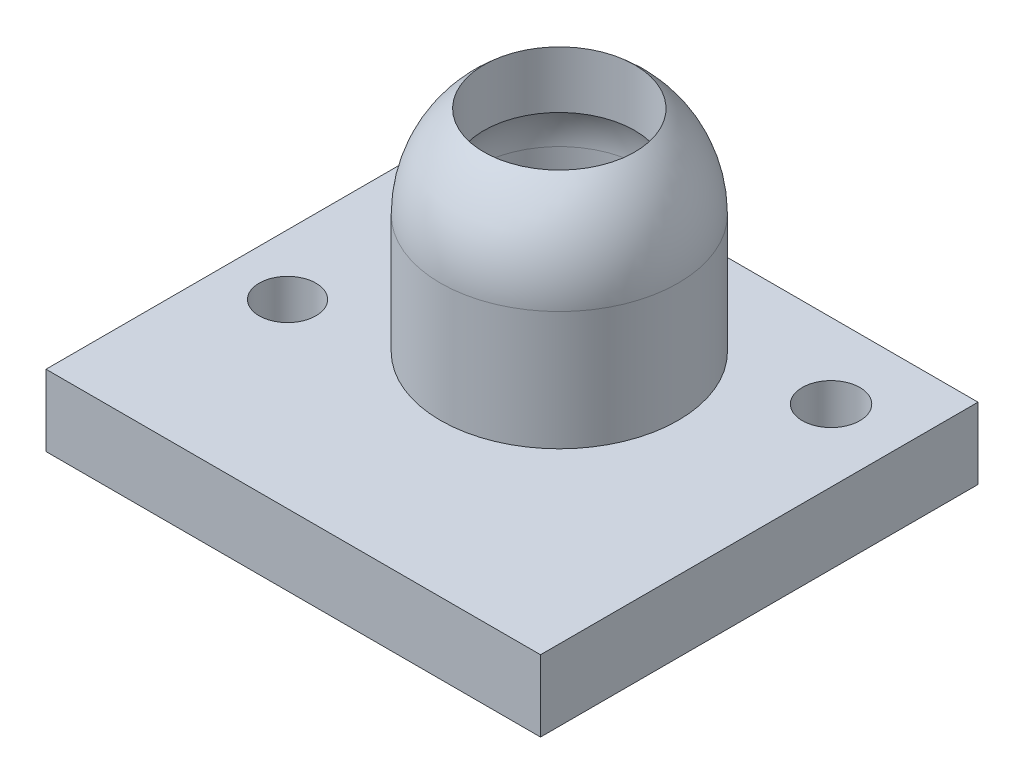
ISO-10303-21;
HEADER;
FILE_DESCRIPTION(('STEP AP214'),'2;1');
FILE_NAME('part.step','',(''),(''),'','','');
FILE_SCHEMA(('AUTOMOTIVE_DESIGN { 1 0 10303 214 1 1 1 1 }'));
ENDSEC;
DATA;
#1=APPLICATION_CONTEXT('core data for automotive mechanical design processes');
#2=APPLICATION_PROTOCOL_DEFINITION('international standard','automotive_design',2000,#1);
#3=PRODUCT_CONTEXT('',#1,'mechanical');
#4=PRODUCT('Part','Part','',(#3));
#5=PRODUCT_RELATED_PRODUCT_CATEGORY('part','',(#4));
#6=PRODUCT_DEFINITION_FORMATION('','',#4);
#7=PRODUCT_DEFINITION_CONTEXT('part definition',#1,'design');
#8=PRODUCT_DEFINITION('design','',#6,#7);
#9=PRODUCT_DEFINITION_SHAPE('','',#8);
#10=(LENGTH_UNIT() NAMED_UNIT(*) SI_UNIT(.MILLI.,.METRE.));
#11=(NAMED_UNIT(*) PLANE_ANGLE_UNIT() SI_UNIT($,.RADIAN.));
#12=(NAMED_UNIT(*) SI_UNIT($,.STERADIAN.) SOLID_ANGLE_UNIT());
#13=UNCERTAINTY_MEASURE_WITH_UNIT(LENGTH_MEASURE(1.E-05),#10,'distance_accuracy_value','');
#14=(GEOMETRIC_REPRESENTATION_CONTEXT(3) GLOBAL_UNCERTAINTY_ASSIGNED_CONTEXT((#13)) GLOBAL_UNIT_ASSIGNED_CONTEXT((#10,
#11,#12)) REPRESENTATION_CONTEXT('',''));
#15=CARTESIAN_POINT('',(0.,0.,0.));
#16=DIRECTION('',(0.,0.,1.));
#17=DIRECTION('',(1.,0.,0.));
#18=AXIS2_PLACEMENT_3D('',#15,#16,#17);
#19=CARTESIAN_POINT('',(79.5851597615702,-9.99999999999976,-34.8006831120019));
#20=DIRECTION('',(0.,-1.,0.));
#21=DIRECTION('',(0.,0.,-1.));
#22=AXIS2_PLACEMENT_3D('',#19,#20,#21);
#23=PLANE('',#22);
#24=CARTESIAN_POINT('',(79.5851597615702,-9.99999999999976,-34.8006831120019));
#25=DIRECTION('',(0.,-1.,0.));
#26=DIRECTION('',(0.,0.,-1.));
#27=AXIS2_PLACEMENT_3D('',#24,#25,#26);
#28=CIRCLE('',#27,1.25);
#29=CARTESIAN_POINT('',(79.5851597615702,-9.99999999999975,-36.0506831120019));
#30=VERTEX_POINT('',#29);
#31=EDGE_CURVE('E215',#30,#30,#28,.T.);
#32=ORIENTED_EDGE('',*,*,#31,.F.);
#33=EDGE_LOOP('',(#32));
#34=FACE_BOUND('',#33,.T.);
#35=CARTESIAN_POINT('',(79.5851597615702,-9.99999999999976,-34.8006831120019));
#36=DIRECTION('',(0.,-1.,0.));
#37=DIRECTION('',(0.,0.,-1.));
#38=AXIS2_PLACEMENT_3D('',#35,#36,#37);
#39=CIRCLE('',#38,2.04999999999999);
#40=CARTESIAN_POINT('',(79.5851597615702,-9.99999999999974,-36.8506831120019));
#41=VERTEX_POINT('',#40);
#42=EDGE_CURVE('E382',#41,#41,#39,.T.);
#43=ORIENTED_EDGE('',*,*,#42,.T.);
#44=EDGE_LOOP('',(#43));
#45=FACE_BOUND('',#44,.T.);
#46=ADVANCED_FACE('F39',(#34,#45),#23,.T.);
#47=CARTESIAN_POINT('',(79.5851597615702,0.,-34.8006831120019));
#48=DIRECTION('',(-1.,0.,0.));
#49=DIRECTION('',(0.,0.,1.));
#50=AXIS2_PLACEMENT_3D('',#47,#48,#49);
#51=SPHERICAL_SURFACE('',#50,5.);
#52=CARTESIAN_POINT('',(79.5851597615702,0.,-34.8006831120019));
#53=DIRECTION('',(0.,-1.,0.));
#54=DIRECTION('',(0.,0.,-1.));
#55=AXIS2_PLACEMENT_3D('',#52,#53,#54);
#56=SPHERICAL_SURFACE('',#55,5.);
#57=CARTESIAN_POINT('',(79.5851597615702,3.86256067913504,-34.8006831120019));
#58=DIRECTION('',(0.,-1.,0.));
#59=DIRECTION('',(0.,0.,-1.));
#60=AXIS2_PLACEMENT_3D('',#57,#58,#59);
#61=CIRCLE('',#60,3.17499999999999);
#62=CARTESIAN_POINT('',(79.5851597615702,3.86256067913504,-37.9756831120019));
#63=VERTEX_POINT('',#62);
#64=EDGE_CURVE('E138',#63,#63,#61,.T.);
#65=ORIENTED_EDGE('',*,*,#64,.T.);
#66=EDGE_LOOP('',(#65));
#67=FACE_BOUND('',#66,.T.);
#68=CARTESIAN_POINT('',(79.5851597615702,0.,-34.8006831120019));
#69=DIRECTION('',(0.,-1.,0.));
#70=DIRECTION('',(0.,0.,-1.));
#71=AXIS2_PLACEMENT_3D('',#68,#69,#70);
#72=CIRCLE('',#71,5.);
#73=CARTESIAN_POINT('',(79.5851597615702,0.,-39.8006831120019));
#74=VERTEX_POINT('',#73);
#75=EDGE_CURVE('E11',#74,#74,#72,.T.);
#76=ORIENTED_EDGE('',*,*,#75,.F.);
#77=EDGE_LOOP('',(#76));
#78=FACE_BOUND('',#77,.T.);
#79=ADVANCED_FACE('F41',(#67,#78),#56,.T.);
#80=CARTESIAN_POINT('',(79.5851597615702,-4.99999999999976,-34.8006831120019));
#81=DIRECTION('',(0.,1.,0.));
#82=DIRECTION('',(0.,0.,1.));
#83=AXIS2_PLACEMENT_3D('',#80,#81,#82);
#84=CYLINDRICAL_SURFACE('',#83,5.00000000000001);
#85=CARTESIAN_POINT('',(79.5851597615702,-4.99999999999976,-34.8006831120019));
#86=DIRECTION('',(0.,-1.,0.));
#87=DIRECTION('',(0.,0.,-1.));
#88=AXIS2_PLACEMENT_3D('',#85,#86,#87);
#89=CIRCLE('',#88,5.00000000000001);
#90=CARTESIAN_POINT('',(79.5851597615702,-4.99999999999972,-39.8006831120019));
#91=VERTEX_POINT('',#90);
#92=EDGE_CURVE('E142',#91,#91,#89,.T.);
#93=ORIENTED_EDGE('',*,*,#92,.F.);
#94=EDGE_LOOP('',(#93));
#95=FACE_BOUND('',#94,.T.);
#96=ORIENTED_EDGE('',*,*,#75,.T.);
#97=EDGE_LOOP('',(#96));
#98=FACE_BOUND('',#97,.T.);
#99=ADVANCED_FACE('F185',(#95,#98),#84,.T.);
#100=CARTESIAN_POINT('',(79.5851597615702,-4.99999999999976,-34.8006831120019));
#101=DIRECTION('',(0.,1.,0.));
#102=DIRECTION('',(0.,0.,1.));
#103=AXIS2_PLACEMENT_3D('',#100,#101,#102);
#104=CYLINDRICAL_SURFACE('',#103,3.49999999999998);
#105=CARTESIAN_POINT('',(79.5851597615702,0.,-34.8006831120019));
#106=DIRECTION('',(0.,1.,0.));
#107=DIRECTION('',(0.,0.,-1.));
#108=AXIS2_PLACEMENT_3D('',#105,#106,#107);
#109=CIRCLE('',#108,3.49999999999999);
#110=CARTESIAN_POINT('',(79.5851597615702,0.,-38.3006831120019));
#111=VERTEX_POINT('',#110);
#112=EDGE_CURVE('E50',#111,#111,#109,.T.);
#113=ORIENTED_EDGE('',*,*,#112,.T.);
#114=EDGE_LOOP('',(#113));
#115=FACE_BOUND('',#114,.T.);
#116=CARTESIAN_POINT('',(79.5851597615702,-7.99999999999976,-34.8006831120019));
#117=DIRECTION('',(0.,-1.,0.));
#118=DIRECTION('',(0.,0.,-1.));
#119=AXIS2_PLACEMENT_3D('',#116,#117,#118);
#120=CIRCLE('',#119,3.49999999999998);
#121=CARTESIAN_POINT('',(79.5851597615702,-7.99999999999973,-38.3006831120019));
#122=VERTEX_POINT('',#121);
#123=EDGE_CURVE('E111',#122,#122,#120,.F.);
#124=ORIENTED_EDGE('',*,*,#123,.F.);
#125=EDGE_LOOP('',(#124));
#126=FACE_BOUND('',#125,.T.);
#127=ADVANCED_FACE('F244',(#115,#126),#104,.F.);
#128=CARTESIAN_POINT('',(79.5851597615702,0.,-34.8006831120019));
#129=DIRECTION('',(-1.,0.,0.));
#130=DIRECTION('',(0.,0.,-1.));
#131=AXIS2_PLACEMENT_3D('',#128,#129,#130);
#132=SPHERICAL_SURFACE('',#131,3.49999999999999);
#133=CARTESIAN_POINT('',(79.5851597615702,0.,-34.8006831120019));
#134=DIRECTION('',(0.,-1.,0.));
#135=DIRECTION('',(0.,0.,-1.));
#136=AXIS2_PLACEMENT_3D('',#133,#134,#135);
#137=SPHERICAL_SURFACE('',#136,3.49999999999999);
#138=CARTESIAN_POINT('',(79.5851597615702,1.47287983216554,-34.8006831120019));
#139=DIRECTION('',(0.,-1.,0.));
#140=DIRECTION('',(0.,0.,-1.));
#141=AXIS2_PLACEMENT_3D('',#138,#139,#140);
#142=CIRCLE('',#141,3.17499999999999);
#143=CARTESIAN_POINT('',(79.5851597615702,1.47287983216554,-37.9756831120019));
#144=VERTEX_POINT('',#143);
#145=EDGE_CURVE('E137',#144,#144,#142,.F.);
#146=ORIENTED_EDGE('',*,*,#145,.T.);
#147=EDGE_LOOP('',(#146));
#148=FACE_BOUND('',#147,.T.);
#149=ORIENTED_EDGE('',*,*,#112,.F.);
#150=EDGE_LOOP('',(#149));
#151=FACE_BOUND('',#150,.T.);
#152=ADVANCED_FACE('F242',(#148,#151),#137,.F.);
#153=CARTESIAN_POINT('',(79.5851597615702,-4.99999999999976,-34.8006831120019));
#154=DIRECTION('',(0.,-1.,0.));
#155=DIRECTION('',(0.,0.,-1.));
#156=AXIS2_PLACEMENT_3D('',#153,#154,#155);
#157=CYLINDRICAL_SURFACE('',#156,3.17499999999999);
#158=ORIENTED_EDGE('',*,*,#145,.F.);
#159=EDGE_LOOP('',(#158));
#160=FACE_BOUND('',#159,.T.);
#161=ORIENTED_EDGE('',*,*,#64,.F.);
#162=EDGE_LOOP('',(#161));
#163=FACE_BOUND('',#162,.T.);
#164=ADVANCED_FACE('F239',(#160,#163),#157,.F.);
#165=CARTESIAN_POINT('',(0.,-7.99999999999984,-23.3706831120019));
#166=DIRECTION('',(0.,0.,1.));
#167=DIRECTION('',(0.,-1.,0.));
#168=AXIS2_PLACEMENT_3D('',#165,#166,#167);
#169=PLANE('',#168);
#170=DIRECTION('',(1.,0.,0.));
#171=VECTOR('',#170,1.);
#172=CARTESIAN_POINT('',(0.,-4.99999999999984,-23.3706831120019));
#173=LINE('',#172,#171);
#174=CARTESIAN_POINT('',(69.4251597615702,-4.99999999999984,-23.3706831120019));
#175=VERTEX_POINT('',#174);
#176=CARTESIAN_POINT('',(90.2251597615702,-4.99999999999984,-23.3706831120019));
#177=VERTEX_POINT('',#176);
#178=EDGE_CURVE('E118',#175,#177,#173,.T.);
#179=ORIENTED_EDGE('',*,*,#178,.F.);
#180=DIRECTION('',(0.,1.,0.));
#181=VECTOR('',#180,1.);
#182=CARTESIAN_POINT('',(69.4251597615702,-7.99999999999984,-23.3706831120019));
#183=LINE('',#182,#181);
#184=CARTESIAN_POINT('',(69.4251597615702,-7.99999999999984,-23.3706831120019));
#185=VERTEX_POINT('',#184);
#186=EDGE_CURVE('E82',#185,#175,#183,.T.);
#187=ORIENTED_EDGE('',*,*,#186,.F.);
#188=DIRECTION('',(1.,0.,0.));
#189=VECTOR('',#188,1.);
#190=CARTESIAN_POINT('',(0.,-7.99999999999984,-23.3706831120019));
#191=LINE('',#190,#189);
#192=CARTESIAN_POINT('',(90.2251597615702,-7.99999999999984,-23.3706831120019));
#193=VERTEX_POINT('',#192);
#194=EDGE_CURVE('E93',#185,#193,#191,.T.);
#195=ORIENTED_EDGE('',*,*,#194,.T.);
#196=DIRECTION('',(0.,1.,0.));
#197=VECTOR('',#196,1.);
#198=CARTESIAN_POINT('',(90.2251597615702,-7.99999999999984,-23.3706831120019));
#199=LINE('',#198,#197);
#200=EDGE_CURVE('E59',#193,#177,#199,.T.);
#201=ORIENTED_EDGE('',*,*,#200,.T.);
#202=EDGE_LOOP('',(#179,#187,#195,#201));
#203=FACE_BOUND('',#202,.T.);
#204=ADVANCED_FACE('F223',(#203),#169,.T.);
#205=CARTESIAN_POINT('',(69.4251597615702,-8.,0.));
#206=DIRECTION('',(1.,0.,0.));
#207=DIRECTION('',(0.,0.,-1.));
#208=AXIS2_PLACEMENT_3D('',#205,#206,#207);
#209=PLANE('',#208);
#210=DIRECTION('',(0.,0.,-1.));
#211=VECTOR('',#210,1.);
#212=CARTESIAN_POINT('',(69.4251597615702,-5.,0.));
#213=LINE('',#212,#211);
#214=CARTESIAN_POINT('',(69.4251597615702,-4.99999999999971,-41.7706831120019));
#215=VERTEX_POINT('',#214);
#216=EDGE_CURVE('E101',#175,#215,#213,.T.);
#217=ORIENTED_EDGE('',*,*,#216,.T.);
#218=DIRECTION('',(0.,1.,0.));
#219=VECTOR('',#218,1.);
#220=CARTESIAN_POINT('',(69.4251597615702,-7.99999999999971,-41.7706831120019));
#221=LINE('',#220,#219);
#222=CARTESIAN_POINT('',(69.4251597615702,-7.99999999999971,-41.7706831120019));
#223=VERTEX_POINT('',#222);
#224=EDGE_CURVE('E98',#223,#215,#221,.T.);
#225=ORIENTED_EDGE('',*,*,#224,.F.);
#226=DIRECTION('',(0.,0.,-1.));
#227=VECTOR('',#226,1.);
#228=CARTESIAN_POINT('',(69.4251597615702,-8.,0.));
#229=LINE('',#228,#227);
#230=EDGE_CURVE('E87',#185,#223,#229,.T.);
#231=ORIENTED_EDGE('',*,*,#230,.F.);
#232=ORIENTED_EDGE('',*,*,#186,.T.);
#233=EDGE_LOOP('',(#217,#225,#231,#232));
#234=FACE_BOUND('',#233,.T.);
#235=ADVANCED_FACE('F99',(#234),#209,.F.);
#236=CARTESIAN_POINT('',(0.,-7.99999999999971,-41.7706831120019));
#237=DIRECTION('',(0.,0.,1.));
#238=DIRECTION('',(0.,-1.,0.));
#239=AXIS2_PLACEMENT_3D('',#236,#237,#238);
#240=PLANE('',#239);
#241=DIRECTION('',(1.,0.,0.));
#242=VECTOR('',#241,1.);
#243=CARTESIAN_POINT('',(0.,-4.99999999999971,-41.7706831120019));
#244=LINE('',#243,#242);
#245=CARTESIAN_POINT('',(90.2251597615702,-4.99999999999971,-41.7706831120019));
#246=VERTEX_POINT('',#245);
#247=EDGE_CURVE('E124',#215,#246,#244,.T.);
#248=ORIENTED_EDGE('',*,*,#247,.T.);
#249=DIRECTION('',(0.,1.,0.));
#250=VECTOR('',#249,1.);
#251=CARTESIAN_POINT('',(90.2251597615702,-7.99999999999971,-41.7706831120019));
#252=LINE('',#251,#250);
#253=CARTESIAN_POINT('',(90.2251597615702,-7.99999999999971,-41.7706831120019));
#254=VERTEX_POINT('',#253);
#255=EDGE_CURVE('E74',#254,#246,#252,.T.);
#256=ORIENTED_EDGE('',*,*,#255,.F.);
#257=DIRECTION('',(1.,0.,0.));
#258=VECTOR('',#257,1.);
#259=CARTESIAN_POINT('',(0.,-7.99999999999971,-41.7706831120019));
#260=LINE('',#259,#258);
#261=EDGE_CURVE('E92',#223,#254,#260,.T.);
#262=ORIENTED_EDGE('',*,*,#261,.F.);
#263=ORIENTED_EDGE('',*,*,#224,.T.);
#264=EDGE_LOOP('',(#248,#256,#262,#263));
#265=FACE_BOUND('',#264,.T.);
#266=ADVANCED_FACE('F106',(#265),#240,.F.);
#267=CARTESIAN_POINT('',(90.2251597615702,-8.,0.));
#268=DIRECTION('',(1.,0.,0.));
#269=DIRECTION('',(0.,0.,-1.));
#270=AXIS2_PLACEMENT_3D('',#267,#268,#269);
#271=PLANE('',#270);
#272=DIRECTION('',(0.,0.,-1.));
#273=VECTOR('',#272,1.);
#274=CARTESIAN_POINT('',(90.2251597615702,-5.,0.));
#275=LINE('',#274,#273);
#276=EDGE_CURVE('E127',#177,#246,#275,.T.);
#277=ORIENTED_EDGE('',*,*,#276,.F.);
#278=ORIENTED_EDGE('',*,*,#200,.F.);
#279=DIRECTION('',(0.,0.,-1.));
#280=VECTOR('',#279,1.);
#281=CARTESIAN_POINT('',(90.2251597615702,-8.,0.));
#282=LINE('',#281,#280);
#283=EDGE_CURVE('E108',#193,#254,#282,.T.);
#284=ORIENTED_EDGE('',*,*,#283,.T.);
#285=ORIENTED_EDGE('',*,*,#255,.T.);
#286=EDGE_LOOP('',(#277,#278,#284,#285));
#287=FACE_BOUND('',#286,.T.);
#288=ADVANCED_FACE('F224',(#287),#271,.T.);
#289=CARTESIAN_POINT('',(0.,-8.,0.));
#290=DIRECTION('',(0.,-1.,0.));
#291=DIRECTION('',(0.,0.,-1.));
#292=AXIS2_PLACEMENT_3D('',#289,#290,#291);
#293=PLANE('',#292);
#294=CARTESIAN_POINT('',(79.5851597615702,-7.99999999999976,-34.8006831120019));
#295=DIRECTION('',(0.,-1.,0.));
#296=DIRECTION('',(0.,0.,-1.));
#297=AXIS2_PLACEMENT_3D('',#294,#295,#296);
#298=CIRCLE('',#297,4.00000000000001);
#299=CARTESIAN_POINT('',(79.5851597615702,-7.99999999999973,-38.8006831120019));
#300=VERTEX_POINT('',#299);
#301=EDGE_CURVE('E206',#300,#300,#298,.T.);
#302=ORIENTED_EDGE('',*,*,#301,.F.);
#303=EDGE_LOOP('',(#302));
#304=FACE_BOUND('',#303,.T.);
#305=CARTESIAN_POINT('',(87.2051597615702,-7.99999999999973,-38.6106831120019));
#306=DIRECTION('',(0.,-1.,0.));
#307=DIRECTION('',(0.,0.,-1.));
#308=AXIS2_PLACEMENT_3D('',#305,#306,#307);
#309=CIRCLE('',#308,1.21158176911051);
#310=CARTESIAN_POINT('',(87.2051597615702,-7.99999999999972,-39.8222648811124));
#311=VERTEX_POINT('',#310);
#312=EDGE_CURVE('E155',#311,#311,#309,.T.);
#313=ORIENTED_EDGE('',*,*,#312,.F.);
#314=EDGE_LOOP('',(#313));
#315=FACE_BOUND('',#314,.T.);
#316=CARTESIAN_POINT('',(71.9651597615702,-7.99999999999978,-30.9906831120019));
#317=DIRECTION('',(0.,-1.,0.));
#318=DIRECTION('',(0.,0.,-1.));
#319=AXIS2_PLACEMENT_3D('',#316,#317,#318);
#320=CIRCLE('',#319,1.1931974306219);
#321=CARTESIAN_POINT('',(71.9651597615702,-7.99999999999978,-32.1838805426238));
#322=VERTEX_POINT('',#321);
#323=EDGE_CURVE('E212',#322,#322,#320,.T.);
#324=ORIENTED_EDGE('',*,*,#323,.F.);
#325=EDGE_LOOP('',(#324));
#326=FACE_BOUND('',#325,.T.);
#327=ORIENTED_EDGE('',*,*,#194,.F.);
#328=ORIENTED_EDGE('',*,*,#230,.T.);
#329=ORIENTED_EDGE('',*,*,#261,.T.);
#330=ORIENTED_EDGE('',*,*,#283,.F.);
#331=EDGE_LOOP('',(#327,#328,#329,#330));
#332=FACE_BOUND('',#331,.T.);
#333=ADVANCED_FACE('F89',(#304,#315,#326,#332),#293,.T.);
#334=CARTESIAN_POINT('',(0.,-5.,0.));
#335=DIRECTION('',(0.,-1.,0.));
#336=DIRECTION('',(0.,0.,-1.));
#337=AXIS2_PLACEMENT_3D('',#334,#335,#336);
#338=PLANE('',#337);
#339=CARTESIAN_POINT('',(87.2051597615702,-4.99999999999973,-38.6106831120019));
#340=DIRECTION('',(0.,-1.,0.));
#341=DIRECTION('',(0.,0.,-1.));
#342=AXIS2_PLACEMENT_3D('',#339,#340,#341);
#343=CIRCLE('',#342,1.21158176911051);
#344=CARTESIAN_POINT('',(87.2051597615702,-4.99999999999972,-39.8222648811124));
#345=VERTEX_POINT('',#344);
#346=EDGE_CURVE('E121',#345,#345,#343,.T.);
#347=ORIENTED_EDGE('',*,*,#346,.T.);
#348=EDGE_LOOP('',(#347));
#349=FACE_BOUND('',#348,.T.);
#350=CARTESIAN_POINT('',(71.9651597615702,-4.99999999999978,-30.9906831120019));
#351=DIRECTION('',(0.,-1.,0.));
#352=DIRECTION('',(0.,0.,-1.));
#353=AXIS2_PLACEMENT_3D('',#350,#351,#352);
#354=CIRCLE('',#353,1.1931974306219);
#355=CARTESIAN_POINT('',(71.9651597615702,-4.99999999999977,-32.1838805426238));
#356=VERTEX_POINT('',#355);
#357=EDGE_CURVE('E152',#356,#356,#354,.T.);
#358=ORIENTED_EDGE('',*,*,#357,.T.);
#359=EDGE_LOOP('',(#358));
#360=FACE_BOUND('',#359,.T.);
#361=ORIENTED_EDGE('',*,*,#92,.T.);
#362=EDGE_LOOP('',(#361));
#363=FACE_BOUND('',#362,.T.);
#364=ORIENTED_EDGE('',*,*,#178,.T.);
#365=ORIENTED_EDGE('',*,*,#276,.T.);
#366=ORIENTED_EDGE('',*,*,#247,.F.);
#367=ORIENTED_EDGE('',*,*,#216,.F.);
#368=EDGE_LOOP('',(#364,#365,#366,#367));
#369=FACE_BOUND('',#368,.T.);
#370=ADVANCED_FACE('F160',(#349,#360,#363,#369),#338,.F.);
#371=CARTESIAN_POINT('',(71.9651597615702,3.86256067913509,-30.9906831120018));
#372=DIRECTION('',(0.,-1.,0.));
#373=DIRECTION('',(0.,0.,-1.));
#374=AXIS2_PLACEMENT_3D('',#371,#372,#373);
#375=CYLINDRICAL_SURFACE('',#374,1.1931974306219);
#376=CARTESIAN_POINT('',(71.9651597615702,-7.99999999999978,-32.1838805426238));
#377=CARTESIAN_POINT('',(71.9651597615702,-7.96874999999978,-32.1838805426238));
#378=CARTESIAN_POINT('',(71.9651597615702,-7.93749999999978,-32.1838805426238));
#379=CARTESIAN_POINT('',(71.9651597615702,-7.87499999999978,-32.1838805426238));
#380=CARTESIAN_POINT('',(71.9651597615702,-7.84374999999978,-32.1838805426238));
#381=CARTESIAN_POINT('',(71.9651597615702,-7.78124999999978,-32.1838805426238));
#382=CARTESIAN_POINT('',(71.9651597615702,-7.74999999999978,-32.1838805426238));
#383=CARTESIAN_POINT('',(71.9651597615702,-7.68749999999978,-32.1838805426238));
#384=CARTESIAN_POINT('',(71.9651597615702,-7.65624999999978,-32.1838805426238));
#385=CARTESIAN_POINT('',(71.9651597615702,-7.59374999999978,-32.1838805426238));
#386=CARTESIAN_POINT('',(71.9651597615702,-7.56249999999978,-32.1838805426238));
#387=CARTESIAN_POINT('',(71.9651597615702,-7.49999999999978,-32.1838805426238));
#388=CARTESIAN_POINT('',(71.9651597615702,-7.46874999999978,-32.1838805426238));
#389=CARTESIAN_POINT('',(71.9651597615702,-7.40624999999978,-32.1838805426238));
#390=CARTESIAN_POINT('',(71.9651597615702,-7.37499999999978,-32.1838805426238));
#391=CARTESIAN_POINT('',(71.9651597615702,-7.31249999999978,-32.1838805426238));
#392=CARTESIAN_POINT('',(71.9651597615702,-7.28124999999978,-32.1838805426238));
#393=CARTESIAN_POINT('',(71.9651597615702,-7.21874999999978,-32.1838805426238));
#394=CARTESIAN_POINT('',(71.9651597615702,-7.18749999999978,-32.1838805426238));
#395=CARTESIAN_POINT('',(71.9651597615702,-7.12499999999978,-32.1838805426238));
#396=CARTESIAN_POINT('',(71.9651597615702,-7.09374999999978,-32.1838805426238));
#397=CARTESIAN_POINT('',(71.9651597615702,-7.03124999999978,-32.1838805426238));
#398=CARTESIAN_POINT('',(71.9651597615702,-6.99999999999978,-32.1838805426238));
#399=CARTESIAN_POINT('',(71.9651597615702,-6.93749999999978,-32.1838805426238));
#400=CARTESIAN_POINT('',(71.9651597615702,-6.90624999999978,-32.1838805426238));
#401=CARTESIAN_POINT('',(71.9651597615702,-6.84374999999978,-32.1838805426238));
#402=CARTESIAN_POINT('',(71.9651597615702,-6.81249999999978,-32.1838805426238));
#403=CARTESIAN_POINT('',(71.9651597615702,-6.74999999999978,-32.1838805426238));
#404=CARTESIAN_POINT('',(71.9651597615702,-6.71874999999978,-32.1838805426238));
#405=CARTESIAN_POINT('',(71.9651597615702,-6.65624999999978,-32.1838805426238));
#406=CARTESIAN_POINT('',(71.9651597615702,-6.62499999999978,-32.1838805426238));
#407=CARTESIAN_POINT('',(71.9651597615702,-6.56249999999978,-32.1838805426238));
#408=CARTESIAN_POINT('',(71.9651597615702,-6.53124999999978,-32.1838805426238));
#409=CARTESIAN_POINT('',(71.9651597615702,-6.46874999999978,-32.1838805426238));
#410=CARTESIAN_POINT('',(71.9651597615702,-6.43749999999978,-32.1838805426238));
#411=CARTESIAN_POINT('',(71.9651597615702,-6.37499999999978,-32.1838805426238));
#412=CARTESIAN_POINT('',(71.9651597615702,-6.34374999999978,-32.1838805426238));
#413=CARTESIAN_POINT('',(71.9651597615702,-6.28124999999978,-32.1838805426238));
#414=CARTESIAN_POINT('',(71.9651597615702,-6.24999999999977,-32.1838805426238));
#415=CARTESIAN_POINT('',(71.9651597615702,-6.18749999999977,-32.1838805426238));
#416=CARTESIAN_POINT('',(71.9651597615702,-6.15624999999977,-32.1838805426238));
#417=CARTESIAN_POINT('',(71.9651597615702,-6.09374999999977,-32.1838805426238));
#418=CARTESIAN_POINT('',(71.9651597615702,-6.06249999999977,-32.1838805426238));
#419=CARTESIAN_POINT('',(71.9651597615702,-5.99999999999977,-32.1838805426238));
#420=CARTESIAN_POINT('',(71.9651597615702,-5.96874999999977,-32.1838805426238));
#421=CARTESIAN_POINT('',(71.9651597615702,-5.90624999999977,-32.1838805426238));
#422=CARTESIAN_POINT('',(71.9651597615702,-5.87499999999977,-32.1838805426238));
#423=CARTESIAN_POINT('',(71.9651597615702,-5.81249999999977,-32.1838805426238));
#424=CARTESIAN_POINT('',(71.9651597615702,-5.78124999999977,-32.1838805426238));
#425=CARTESIAN_POINT('',(71.9651597615702,-5.71874999999977,-32.1838805426238));
#426=CARTESIAN_POINT('',(71.9651597615702,-5.68749999999977,-32.1838805426238));
#427=CARTESIAN_POINT('',(71.9651597615702,-5.62499999999977,-32.1838805426238));
#428=CARTESIAN_POINT('',(71.9651597615702,-5.59374999999977,-32.1838805426238));
#429=CARTESIAN_POINT('',(71.9651597615702,-5.53124999999977,-32.1838805426238));
#430=CARTESIAN_POINT('',(71.9651597615702,-5.49999999999977,-32.1838805426238));
#431=CARTESIAN_POINT('',(71.9651597615702,-5.43749999999977,-32.1838805426238));
#432=CARTESIAN_POINT('',(71.9651597615702,-5.40624999999977,-32.1838805426238));
#433=CARTESIAN_POINT('',(71.9651597615702,-5.34374999999977,-32.1838805426238));
#434=CARTESIAN_POINT('',(71.9651597615702,-5.31249999999977,-32.1838805426238));
#435=CARTESIAN_POINT('',(71.9651597615702,-5.24999999999977,-32.1838805426238));
#436=CARTESIAN_POINT('',(71.9651597615702,-5.21874999999977,-32.1838805426238));
#437=CARTESIAN_POINT('',(71.9651597615702,-5.15624999999977,-32.1838805426238));
#438=CARTESIAN_POINT('',(71.9651597615702,-5.12499999999977,-32.1838805426238));
#439=CARTESIAN_POINT('',(71.9651597615702,-5.06249999999977,-32.1838805426238));
#440=CARTESIAN_POINT('',(71.9651597615702,-5.03124999999977,-32.1838805426238));
#441=CARTESIAN_POINT('',(71.9651597615702,-4.99999999999977,-32.1838805426238));
#442=B_SPLINE_CURVE_WITH_KNOTS('',3,(#376,#377,#378,#379,#380,#381,#382,#383,#384,#385,#386,
#387,#388,#389,#390,#391,#392,#393,#394,#395,#396,#397,#398,#399,#400,#401,#402,#403,#404,#405,
#406,#407,#408,#409,#410,#411,#412,#413,#414,#415,#416,#417,#418,#419,#420,#421,#422,#423,#424,
#425,#426,#427,#428,#429,#430,#431,#432,#433,#434,#435,#436,#437,#438,#439,#440,#441),
.UNSPECIFIED.,.F.,.F.,(4,2,2,2,2,2,2,2,2,2,2,2,2,2,2,2,2,2,2,2,2,2,2,2,2,2,2,2,2,2,2,2,4),(0.,
0.0937500000000001,0.1875,0.28125,0.375,0.46875,0.5625,0.656250000000001,0.750000000000001,
0.843750000000001,0.937500000000001,1.03125,1.125,1.21875,1.3125,1.40625,1.5,1.59375,1.6875,
1.78125,1.875,1.96875,2.0625,2.15625,2.25,2.34375,2.4375,2.53125,2.625,2.71875,2.8125,2.90625,
3.),.UNSPECIFIED.);
#443=EDGE_CURVE('BSEAM166',#322,#356,#442,.T.);
#444=ORIENTED_EDGE('',*,*,#323,.T.);
#445=ORIENTED_EDGE('',*,*,#357,.F.);
#446=ORIENTED_EDGE('',*,*,#443,.T.);
#447=ORIENTED_EDGE('',*,*,#443,.F.);
#448=EDGE_LOOP('',(#444,#446,#445,#447));
#449=FACE_BOUND('',#448,.T.);
#450=ADVANCED_FACE('F166',(#449),#375,.F.);
#451=CARTESIAN_POINT('',(87.2051597615702,3.86256067913514,-38.6106831120018));
#452=DIRECTION('',(0.,-1.,0.));
#453=DIRECTION('',(0.,0.,-1.));
#454=AXIS2_PLACEMENT_3D('',#451,#452,#453);
#455=CYLINDRICAL_SURFACE('',#454,1.21158176911051);
#456=CARTESIAN_POINT('',(87.2051597615702,-7.99999999999972,-39.8222648811124));
#457=CARTESIAN_POINT('',(87.2051597615702,-7.96874999999972,-39.8222648811124));
#458=CARTESIAN_POINT('',(87.2051597615702,-7.93749999999972,-39.8222648811124));
#459=CARTESIAN_POINT('',(87.2051597615702,-7.87499999999972,-39.8222648811124));
#460=CARTESIAN_POINT('',(87.2051597615702,-7.84374999999972,-39.8222648811124));
#461=CARTESIAN_POINT('',(87.2051597615702,-7.78124999999972,-39.8222648811124));
#462=CARTESIAN_POINT('',(87.2051597615702,-7.74999999999972,-39.8222648811124));
#463=CARTESIAN_POINT('',(87.2051597615702,-7.68749999999972,-39.8222648811124));
#464=CARTESIAN_POINT('',(87.2051597615702,-7.65624999999972,-39.8222648811124));
#465=CARTESIAN_POINT('',(87.2051597615702,-7.59374999999972,-39.8222648811124));
#466=CARTESIAN_POINT('',(87.2051597615702,-7.56249999999972,-39.8222648811124));
#467=CARTESIAN_POINT('',(87.2051597615702,-7.49999999999972,-39.8222648811124));
#468=CARTESIAN_POINT('',(87.2051597615702,-7.46874999999972,-39.8222648811124));
#469=CARTESIAN_POINT('',(87.2051597615702,-7.40624999999972,-39.8222648811124));
#470=CARTESIAN_POINT('',(87.2051597615702,-7.37499999999972,-39.8222648811124));
#471=CARTESIAN_POINT('',(87.2051597615702,-7.31249999999972,-39.8222648811124));
#472=CARTESIAN_POINT('',(87.2051597615702,-7.28124999999972,-39.8222648811124));
#473=CARTESIAN_POINT('',(87.2051597615702,-7.21874999999972,-39.8222648811124));
#474=CARTESIAN_POINT('',(87.2051597615702,-7.18749999999972,-39.8222648811124));
#475=CARTESIAN_POINT('',(87.2051597615702,-7.12499999999972,-39.8222648811124));
#476=CARTESIAN_POINT('',(87.2051597615702,-7.09374999999972,-39.8222648811124));
#477=CARTESIAN_POINT('',(87.2051597615702,-7.03124999999972,-39.8222648811124));
#478=CARTESIAN_POINT('',(87.2051597615702,-6.99999999999972,-39.8222648811124));
#479=CARTESIAN_POINT('',(87.2051597615702,-6.93749999999972,-39.8222648811124));
#480=CARTESIAN_POINT('',(87.2051597615702,-6.90624999999972,-39.8222648811124));
#481=CARTESIAN_POINT('',(87.2051597615702,-6.84374999999972,-39.8222648811124));
#482=CARTESIAN_POINT('',(87.2051597615702,-6.81249999999972,-39.8222648811124));
#483=CARTESIAN_POINT('',(87.2051597615702,-6.74999999999972,-39.8222648811124));
#484=CARTESIAN_POINT('',(87.2051597615702,-6.71874999999972,-39.8222648811124));
#485=CARTESIAN_POINT('',(87.2051597615702,-6.65624999999972,-39.8222648811124));
#486=CARTESIAN_POINT('',(87.2051597615702,-6.62499999999972,-39.8222648811124));
#487=CARTESIAN_POINT('',(87.2051597615702,-6.56249999999972,-39.8222648811124));
#488=CARTESIAN_POINT('',(87.2051597615702,-6.53124999999972,-39.8222648811124));
#489=CARTESIAN_POINT('',(87.2051597615702,-6.46874999999972,-39.8222648811124));
#490=CARTESIAN_POINT('',(87.2051597615702,-6.43749999999972,-39.8222648811124));
#491=CARTESIAN_POINT('',(87.2051597615702,-6.37499999999972,-39.8222648811124));
#492=CARTESIAN_POINT('',(87.2051597615702,-6.34374999999972,-39.8222648811124));
#493=CARTESIAN_POINT('',(87.2051597615702,-6.28124999999972,-39.8222648811124));
#494=CARTESIAN_POINT('',(87.2051597615702,-6.24999999999972,-39.8222648811124));
#495=CARTESIAN_POINT('',(87.2051597615702,-6.18749999999972,-39.8222648811124));
#496=CARTESIAN_POINT('',(87.2051597615702,-6.15624999999972,-39.8222648811124));
#497=CARTESIAN_POINT('',(87.2051597615702,-6.09374999999972,-39.8222648811124));
#498=CARTESIAN_POINT('',(87.2051597615702,-6.06249999999972,-39.8222648811124));
#499=CARTESIAN_POINT('',(87.2051597615702,-5.99999999999972,-39.8222648811124));
#500=CARTESIAN_POINT('',(87.2051597615702,-5.96874999999972,-39.8222648811124));
#501=CARTESIAN_POINT('',(87.2051597615702,-5.90624999999972,-39.8222648811124));
#502=CARTESIAN_POINT('',(87.2051597615702,-5.87499999999972,-39.8222648811124));
#503=CARTESIAN_POINT('',(87.2051597615702,-5.81249999999972,-39.8222648811124));
#504=CARTESIAN_POINT('',(87.2051597615702,-5.78124999999972,-39.8222648811124));
#505=CARTESIAN_POINT('',(87.2051597615702,-5.71874999999972,-39.8222648811124));
#506=CARTESIAN_POINT('',(87.2051597615702,-5.68749999999972,-39.8222648811124));
#507=CARTESIAN_POINT('',(87.2051597615702,-5.62499999999972,-39.8222648811124));
#508=CARTESIAN_POINT('',(87.2051597615702,-5.59374999999972,-39.8222648811124));
#509=CARTESIAN_POINT('',(87.2051597615702,-5.53124999999972,-39.8222648811124));
#510=CARTESIAN_POINT('',(87.2051597615702,-5.49999999999972,-39.8222648811124));
#511=CARTESIAN_POINT('',(87.2051597615702,-5.43749999999972,-39.8222648811124));
#512=CARTESIAN_POINT('',(87.2051597615702,-5.40624999999972,-39.8222648811124));
#513=CARTESIAN_POINT('',(87.2051597615702,-5.34374999999972,-39.8222648811124));
#514=CARTESIAN_POINT('',(87.2051597615702,-5.31249999999972,-39.8222648811124));
#515=CARTESIAN_POINT('',(87.2051597615702,-5.24999999999972,-39.8222648811124));
#516=CARTESIAN_POINT('',(87.2051597615702,-5.21874999999972,-39.8222648811124));
#517=CARTESIAN_POINT('',(87.2051597615702,-5.15624999999972,-39.8222648811124));
#518=CARTESIAN_POINT('',(87.2051597615702,-5.12499999999972,-39.8222648811124));
#519=CARTESIAN_POINT('',(87.2051597615702,-5.06249999999972,-39.8222648811124));
#520=CARTESIAN_POINT('',(87.2051597615702,-5.03124999999972,-39.8222648811124));
#521=CARTESIAN_POINT('',(87.2051597615702,-4.99999999999972,-39.8222648811124));
#522=B_SPLINE_CURVE_WITH_KNOTS('',3,(#456,#457,#458,#459,#460,#461,#462,#463,#464,#465,#466,
#467,#468,#469,#470,#471,#472,#473,#474,#475,#476,#477,#478,#479,#480,#481,#482,#483,#484,#485,
#486,#487,#488,#489,#490,#491,#492,#493,#494,#495,#496,#497,#498,#499,#500,#501,#502,#503,#504,
#505,#506,#507,#508,#509,#510,#511,#512,#513,#514,#515,#516,#517,#518,#519,#520,#521),
.UNSPECIFIED.,.F.,.F.,(4,2,2,2,2,2,2,2,2,2,2,2,2,2,2,2,2,2,2,2,2,2,2,2,2,2,2,2,2,2,2,2,4),(0.,
0.0937500000000001,0.1875,0.28125,0.375,0.46875,0.5625,0.656250000000001,0.750000000000001,
0.843749999999999,0.937499999999999,1.03125,1.125,1.21875,1.3125,1.40625,1.5,1.59375,1.6875,
1.78125,1.875,1.96875,2.0625,2.15625,2.25,2.34375,2.4375,2.53125,2.625,2.71875,2.8125,2.90625,
3.),.UNSPECIFIED.);
#523=EDGE_CURVE('BSEAM163',#311,#345,#522,.T.);
#524=ORIENTED_EDGE('',*,*,#312,.T.);
#525=ORIENTED_EDGE('',*,*,#346,.F.);
#526=ORIENTED_EDGE('',*,*,#523,.T.);
#527=ORIENTED_EDGE('',*,*,#523,.F.);
#528=EDGE_LOOP('',(#524,#526,#525,#527));
#529=FACE_BOUND('',#528,.T.);
#530=ADVANCED_FACE('F163',(#529),#455,.F.);
#531=CARTESIAN_POINT('',(79.5851597615702,-9.99999999999976,-34.8006831120019));
#532=DIRECTION('',(0.,-1.,0.));
#533=DIRECTION('',(0.,0.,-1.));
#534=AXIS2_PLACEMENT_3D('',#531,#532,#533);
#535=CIRCLE('',#534,3.50000000000001);
#536=CARTESIAN_POINT('',(79.5851597615702,-9.99999999999973,-38.3006831120019));
#537=VERTEX_POINT('',#536);
#538=EDGE_CURVE('E386',#537,#537,#535,.T.);
#539=ORIENTED_EDGE('',*,*,#538,.F.);
#540=EDGE_LOOP('',(#539));
#541=FACE_BOUND('',#540,.T.);
#542=CARTESIAN_POINT('',(79.5851597615702,-9.99999999999976,-34.8006831120019));
#543=DIRECTION('',(0.,-1.,0.));
#544=DIRECTION('',(0.,0.,-1.));
#545=AXIS2_PLACEMENT_3D('',#542,#543,#544);
#546=CIRCLE('',#545,4.00000000000001);
#547=CARTESIAN_POINT('',(79.5851597615702,-9.99999999999973,-38.8006831120019));
#548=VERTEX_POINT('',#547);
#549=EDGE_CURVE('E203',#548,#548,#546,.T.);
#550=ORIENTED_EDGE('',*,*,#549,.T.);
#551=EDGE_LOOP('',(#550));
#552=FACE_BOUND('',#551,.T.);
#553=ADVANCED_FACE('F165',(#541,#552),#23,.T.);
#554=CARTESIAN_POINT('',(79.5851597615702,-9.99999999999976,-34.8006831120019));
#555=DIRECTION('',(0.,1.,0.));
#556=DIRECTION('',(0.,0.,1.));
#557=AXIS2_PLACEMENT_3D('',#554,#555,#556);
#558=CYLINDRICAL_SURFACE('',#557,4.00000000000001);
#559=ORIENTED_EDGE('',*,*,#549,.F.);
#560=EDGE_LOOP('',(#559));
#561=FACE_BOUND('',#560,.T.);
#562=ORIENTED_EDGE('',*,*,#301,.T.);
#563=EDGE_LOOP('',(#562));
#564=FACE_BOUND('',#563,.T.);
#565=ADVANCED_FACE('F173',(#561,#564),#558,.T.);
#566=CARTESIAN_POINT('',(79.5851597615702,-7.99999999999976,-34.8006831120019));
#567=DIRECTION('',(0.,-1.,0.));
#568=DIRECTION('',(0.,0.,-1.));
#569=AXIS2_PLACEMENT_3D('',#566,#567,#568);
#570=PLANE('',#569);
#571=CARTESIAN_POINT('',(79.5851597615702,-7.99999999999976,-34.8006831120019));
#572=DIRECTION('',(0.,-1.,0.));
#573=DIRECTION('',(0.,0.,-1.));
#574=AXIS2_PLACEMENT_3D('',#571,#572,#573);
#575=CIRCLE('',#574,1.25);
#576=CARTESIAN_POINT('',(79.5851597615702,-7.99999999999975,-36.0506831120019));
#577=VERTEX_POINT('',#576);
#578=EDGE_CURVE('E43',#577,#577,#575,.T.);
#579=ORIENTED_EDGE('',*,*,#578,.T.);
#580=EDGE_LOOP('',(#579));
#581=FACE_BOUND('',#580,.T.);
#582=ORIENTED_EDGE('',*,*,#123,.T.);
#583=EDGE_LOOP('',(#582));
#584=FACE_BOUND('',#583,.T.);
#585=ADVANCED_FACE('F193',(#581,#584),#570,.F.);
#586=CARTESIAN_POINT('',(79.5851597615702,-4.99999999999976,-34.8006831120019));
#587=DIRECTION('',(0.,-1.,0.));
#588=DIRECTION('',(0.,0.,-1.));
#589=AXIS2_PLACEMENT_3D('',#586,#587,#588);
#590=CYLINDRICAL_SURFACE('',#589,1.25);
#591=ORIENTED_EDGE('',*,*,#31,.T.);
#592=EDGE_LOOP('',(#591));
#593=FACE_BOUND('',#592,.T.);
#594=ORIENTED_EDGE('',*,*,#578,.F.);
#595=EDGE_LOOP('',(#594));
#596=FACE_BOUND('',#595,.T.);
#597=ADVANCED_FACE('F191',(#593,#596),#590,.F.);
#598=CARTESIAN_POINT('',(79.5851597615702,-9.24999999999976,-34.8006831120019));
#599=DIRECTION('',(0.,-1.,0.));
#600=DIRECTION('',(0.,0.,-1.));
#601=AXIS2_PLACEMENT_3D('',#598,#599,#600);
#602=CYLINDRICAL_SURFACE('',#601,3.50000000000001);
#603=CARTESIAN_POINT('',(79.5851597615702,-9.24999999999976,-34.8006831120019));
#604=DIRECTION('',(0.,-1.,0.));
#605=DIRECTION('',(0.,0.,-1.));
#606=AXIS2_PLACEMENT_3D('',#603,#604,#605);
#607=CIRCLE('',#606,3.50000000000001);
#608=CARTESIAN_POINT('',(79.5851597615702,-9.24999999999973,-38.3006831120019));
#609=VERTEX_POINT('',#608);
#610=EDGE_CURVE('E389',#609,#609,#607,.T.);
#611=ORIENTED_EDGE('',*,*,#610,.F.);
#612=EDGE_LOOP('',(#611));
#613=FACE_BOUND('',#612,.T.);
#614=ORIENTED_EDGE('',*,*,#538,.T.);
#615=EDGE_LOOP('',(#614));
#616=FACE_BOUND('',#615,.T.);
#617=ADVANCED_FACE('F334',(#613,#616),#602,.F.);
#618=CARTESIAN_POINT('',(79.5851597615702,-9.24999999999976,-34.8006831120019));
#619=DIRECTION('',(0.,-1.,0.));
#620=DIRECTION('',(0.,0.,-1.));
#621=AXIS2_PLACEMENT_3D('',#618,#619,#620);
#622=PLANE('',#621);
#623=CARTESIAN_POINT('',(79.5851597615702,-9.24999999999976,-34.8006831120019));
#624=DIRECTION('',(0.,-1.,0.));
#625=DIRECTION('',(0.,0.,-1.));
#626=AXIS2_PLACEMENT_3D('',#623,#624,#625);
#627=CIRCLE('',#626,2.04999999999999);
#628=CARTESIAN_POINT('',(79.5851597615702,-9.24999999999974,-36.8506831120019));
#629=VERTEX_POINT('',#628);
#630=EDGE_CURVE('E379',#629,#629,#627,.T.);
#631=ORIENTED_EDGE('',*,*,#630,.F.);
#632=EDGE_LOOP('',(#631));
#633=FACE_BOUND('',#632,.T.);
#634=ORIENTED_EDGE('',*,*,#610,.T.);
#635=EDGE_LOOP('',(#634));
#636=FACE_BOUND('',#635,.T.);
#637=ADVANCED_FACE('F353',(#633,#636),#622,.T.);
#638=CARTESIAN_POINT('',(79.5851597615702,-9.24999999999976,-34.8006831120019));
#639=DIRECTION('',(0.,-1.,0.));
#640=DIRECTION('',(0.,0.,-1.));
#641=AXIS2_PLACEMENT_3D('',#638,#639,#640);
#642=CYLINDRICAL_SURFACE('',#641,2.04999999999999);
#643=ORIENTED_EDGE('',*,*,#630,.T.);
#644=EDGE_LOOP('',(#643));
#645=FACE_BOUND('',#644,.T.);
#646=ORIENTED_EDGE('',*,*,#42,.F.);
#647=EDGE_LOOP('',(#646));
#648=FACE_BOUND('',#647,.T.);
#649=ADVANCED_FACE('F362',(#645,#648),#642,.T.);
#650=CLOSED_SHELL('',(#46,#79,#99,#127,#152,#164,#204,#235,#266,#288,#333,#370,#450,#530,#553,
#565,#585,#597,#617,#637,#649));
#651=MANIFOLD_SOLID_BREP('B2',#650);
#652=ADVANCED_BREP_SHAPE_REPRESENTATION('',(#18,#651),#14);
#653=SHAPE_DEFINITION_REPRESENTATION(#9,#652);
ENDSEC;
END-ISO-10303-21;
